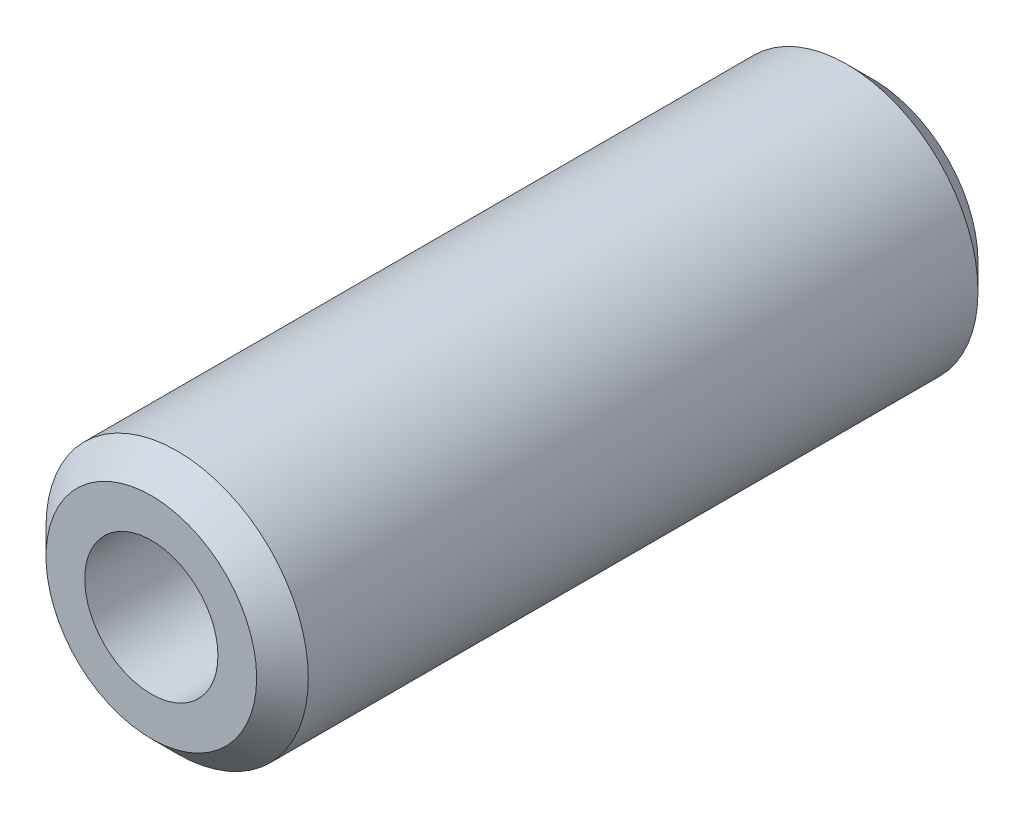
ISO-10303-21;
HEADER;
FILE_DESCRIPTION(('STEP AP214'),'2;1');
FILE_NAME('part.step','',(''),(''),'','','');
FILE_SCHEMA(('AUTOMOTIVE_DESIGN { 1 0 10303 214 1 1 1 1 }'));
ENDSEC;
DATA;
#1=APPLICATION_CONTEXT('core data for automotive mechanical design processes');
#2=APPLICATION_PROTOCOL_DEFINITION('international standard','automotive_design',2000,#1);
#3=PRODUCT_CONTEXT('',#1,'mechanical');
#4=PRODUCT('Part','Part','',(#3));
#5=PRODUCT_RELATED_PRODUCT_CATEGORY('part','',(#4));
#6=PRODUCT_DEFINITION_FORMATION('','',#4);
#7=PRODUCT_DEFINITION_CONTEXT('part definition',#1,'design');
#8=PRODUCT_DEFINITION('design','',#6,#7);
#9=PRODUCT_DEFINITION_SHAPE('','',#8);
#10=(LENGTH_UNIT() NAMED_UNIT(*) SI_UNIT(.MILLI.,.METRE.));
#11=(NAMED_UNIT(*) PLANE_ANGLE_UNIT() SI_UNIT($,.RADIAN.));
#12=(NAMED_UNIT(*) SI_UNIT($,.STERADIAN.) SOLID_ANGLE_UNIT());
#13=UNCERTAINTY_MEASURE_WITH_UNIT(LENGTH_MEASURE(1.E-05),#10,'distance_accuracy_value','');
#14=(GEOMETRIC_REPRESENTATION_CONTEXT(3) GLOBAL_UNCERTAINTY_ASSIGNED_CONTEXT((#13)) GLOBAL_UNIT_ASSIGNED_CONTEXT((#10,
#11,#12)) REPRESENTATION_CONTEXT('',''));
#15=CARTESIAN_POINT('',(0.,0.,0.));
#16=DIRECTION('',(0.,0.,1.));
#17=DIRECTION('',(1.,0.,0.));
#18=AXIS2_PLACEMENT_3D('',#15,#16,#17);
#19=CARTESIAN_POINT('',(0.,0.,69.85));
#20=DIRECTION('',(0.,0.,-1.));
#21=DIRECTION('',(-1.,0.,0.));
#22=AXIS2_PLACEMENT_3D('',#19,#20,#21);
#23=CYLINDRICAL_SURFACE('',#22,12.7);
#24=CARTESIAN_POINT('',(0.,0.,2.5));
#25=DIRECTION('',(0.,0.,1.));
#26=DIRECTION('',(1.,0.,0.));
#27=AXIS2_PLACEMENT_3D('',#24,#25,#26);
#28=CIRCLE('',#27,12.7);
#29=CARTESIAN_POINT('',(12.7,0.,2.5));
#30=VERTEX_POINT('',#29);
#31=EDGE_CURVE('E56',#30,#30,#28,.T.);
#32=ORIENTED_EDGE('',*,*,#31,.T.);
#33=EDGE_LOOP('',(#32));
#34=FACE_BOUND('',#33,.T.);
#35=CARTESIAN_POINT('',(0.,0.,67.35));
#36=DIRECTION('',(0.,0.,1.));
#37=DIRECTION('',(1.,0.,0.));
#38=AXIS2_PLACEMENT_3D('',#35,#36,#37);
#39=CIRCLE('',#38,12.7);
#40=CARTESIAN_POINT('',(12.7,0.,67.35));
#41=VERTEX_POINT('',#40);
#42=EDGE_CURVE('E61',#41,#41,#39,.F.);
#43=ORIENTED_EDGE('',*,*,#42,.T.);
#44=EDGE_LOOP('',(#43));
#45=FACE_BOUND('',#44,.T.);
#46=ADVANCED_FACE('F42',(#34,#45),#23,.T.);
#47=CARTESIAN_POINT('',(0.,0.,69.85));
#48=DIRECTION('',(0.,0.,1.));
#49=DIRECTION('',(1.,0.,0.));
#50=AXIS2_PLACEMENT_3D('',#47,#48,#49);
#51=PLANE('',#50);
#52=CARTESIAN_POINT('',(0.,0.,69.85));
#53=DIRECTION('',(0.,0.,1.));
#54=DIRECTION('',(1.,0.,0.));
#55=AXIS2_PLACEMENT_3D('',#52,#53,#54);
#56=CIRCLE('',#55,10.2);
#57=CARTESIAN_POINT('',(10.2,0.,69.85));
#58=VERTEX_POINT('',#57);
#59=EDGE_CURVE('E10',#58,#58,#56,.T.);
#60=ORIENTED_EDGE('',*,*,#59,.T.);
#61=EDGE_LOOP('',(#60));
#62=FACE_BOUND('',#61,.T.);
#63=CARTESIAN_POINT('',(0.,0.,69.85));
#64=DIRECTION('',(0.,0.,1.));
#65=DIRECTION('',(1.,0.,0.));
#66=AXIS2_PLACEMENT_3D('',#63,#64,#65);
#67=CIRCLE('',#66,6.45);
#68=CARTESIAN_POINT('',(6.45,0.,69.85));
#69=VERTEX_POINT('',#68);
#70=EDGE_CURVE('E67',#69,#69,#67,.T.);
#71=ORIENTED_EDGE('',*,*,#70,.F.);
#72=EDGE_LOOP('',(#71));
#73=FACE_BOUND('',#72,.T.);
#74=ADVANCED_FACE('F88',(#62,#73),#51,.T.);
#75=CARTESIAN_POINT('',(0.,0.,0.));
#76=DIRECTION('',(0.,0.,1.));
#77=DIRECTION('',(1.,0.,0.));
#78=AXIS2_PLACEMENT_3D('',#75,#76,#77);
#79=PLANE('',#78);
#80=CARTESIAN_POINT('',(0.,0.,0.));
#81=DIRECTION('',(0.,0.,1.));
#82=DIRECTION('',(1.,0.,0.));
#83=AXIS2_PLACEMENT_3D('',#80,#81,#82);
#84=CIRCLE('',#83,10.2);
#85=CARTESIAN_POINT('',(10.2,0.,0.));
#86=VERTEX_POINT('',#85);
#87=EDGE_CURVE('E51',#86,#86,#84,.F.);
#88=ORIENTED_EDGE('',*,*,#87,.T.);
#89=EDGE_LOOP('',(#88));
#90=FACE_BOUND('',#89,.T.);
#91=CARTESIAN_POINT('',(0.,0.,0.));
#92=DIRECTION('',(0.,0.,1.));
#93=DIRECTION('',(1.,0.,0.));
#94=AXIS2_PLACEMENT_3D('',#91,#92,#93);
#95=CIRCLE('',#94,6.45);
#96=CARTESIAN_POINT('',(6.45,0.,0.));
#97=VERTEX_POINT('',#96);
#98=EDGE_CURVE('E71',#97,#97,#95,.T.);
#99=ORIENTED_EDGE('',*,*,#98,.T.);
#100=EDGE_LOOP('',(#99));
#101=FACE_BOUND('',#100,.T.);
#102=ADVANCED_FACE('F76',(#90,#101),#79,.F.);
#103=CARTESIAN_POINT('',(0.,0.,0.));
#104=DIRECTION('',(0.,0.,1.));
#105=DIRECTION('',(1.,0.,0.));
#106=AXIS2_PLACEMENT_3D('',#103,#104,#105);
#107=CYLINDRICAL_SURFACE('',#106,6.45);
#108=ORIENTED_EDGE('',*,*,#70,.T.);
#109=EDGE_LOOP('',(#108));
#110=FACE_BOUND('',#109,.T.);
#111=ORIENTED_EDGE('',*,*,#98,.F.);
#112=EDGE_LOOP('',(#111));
#113=FACE_BOUND('',#112,.T.);
#114=ADVANCED_FACE('F78',(#110,#113),#107,.F.);
#115=CARTESIAN_POINT('',(0.,0.,2.5));
#116=DIRECTION('',(0.,0.,1.));
#117=DIRECTION('',(1.,0.,0.));
#118=AXIS2_PLACEMENT_3D('',#115,#116,#117);
#119=CONICAL_SURFACE('',#118,12.7,0.785398163397453);
#120=ORIENTED_EDGE('',*,*,#87,.F.);
#121=EDGE_LOOP('',(#120));
#122=FACE_BOUND('',#121,.T.);
#123=ORIENTED_EDGE('',*,*,#31,.F.);
#124=EDGE_LOOP('',(#123));
#125=FACE_BOUND('',#124,.T.);
#126=ADVANCED_FACE('F80',(#122,#125),#119,.T.);
#127=CARTESIAN_POINT('',(0.,0.,69.85));
#128=DIRECTION('',(0.,0.,-1.));
#129=DIRECTION('',(-1.,0.,0.));
#130=AXIS2_PLACEMENT_3D('',#127,#128,#129);
#131=CONICAL_SURFACE('',#130,10.2,0.785398163397448);
#132=ORIENTED_EDGE('',*,*,#42,.F.);
#133=EDGE_LOOP('',(#132));
#134=FACE_BOUND('',#133,.T.);
#135=ORIENTED_EDGE('',*,*,#59,.F.);
#136=EDGE_LOOP('',(#135));
#137=FACE_BOUND('',#136,.T.);
#138=ADVANCED_FACE('F45',(#134,#137),#131,.T.);
#139=CLOSED_SHELL('',(#46,#74,#102,#114,#126,#138));
#140=MANIFOLD_SOLID_BREP('B2',#139);
#141=ADVANCED_BREP_SHAPE_REPRESENTATION('',(#18,#140),#14);
#142=SHAPE_DEFINITION_REPRESENTATION(#9,#141);
ENDSEC;
END-ISO-10303-21;
